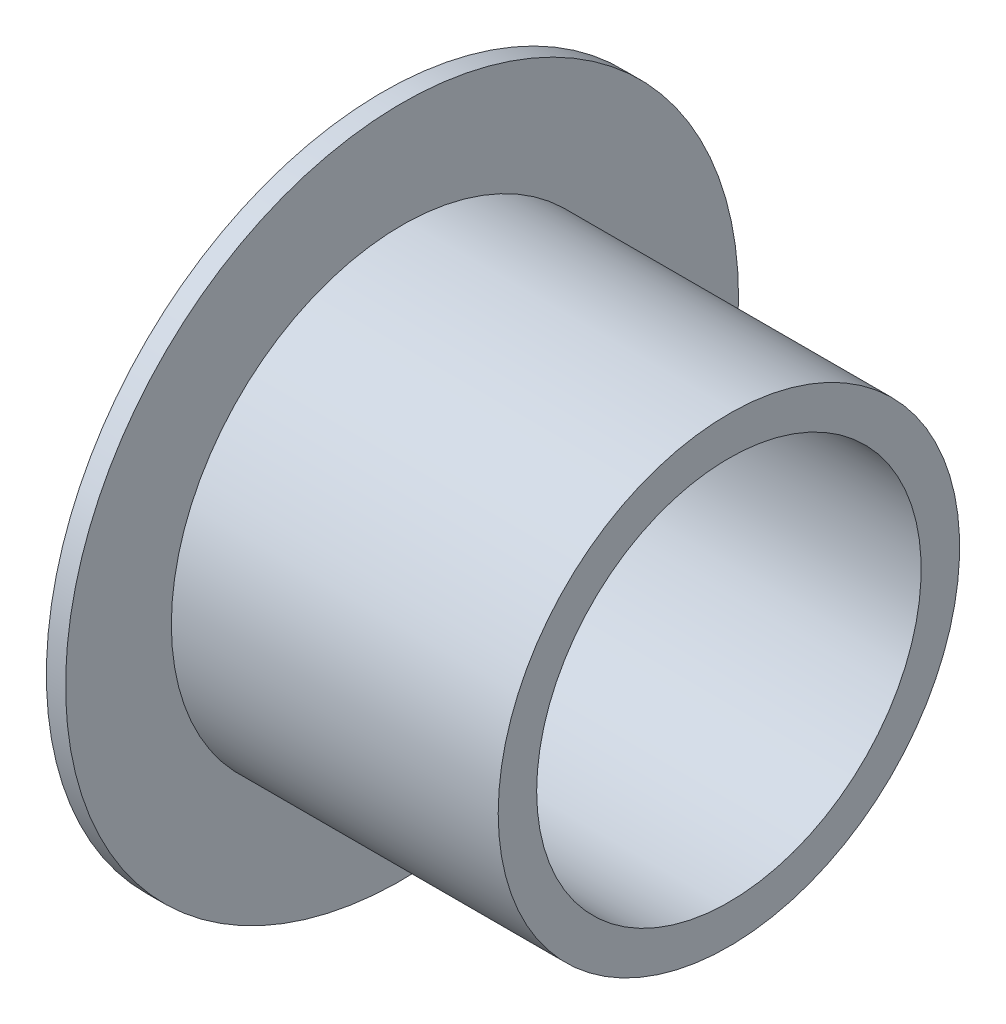
ISO-10303-21;
HEADER;
FILE_DESCRIPTION(('STEP AP214'),'2;1');
FILE_NAME('part.step','',(''),(''),'','','');
FILE_SCHEMA(('AUTOMOTIVE_DESIGN { 1 0 10303 214 1 1 1 1 }'));
ENDSEC;
DATA;
#1=APPLICATION_CONTEXT('core data for automotive mechanical design processes');
#2=APPLICATION_PROTOCOL_DEFINITION('international standard','automotive_design',2000,#1);
#3=PRODUCT_CONTEXT('',#1,'mechanical');
#4=PRODUCT('Part','Part','',(#3));
#5=PRODUCT_RELATED_PRODUCT_CATEGORY('part','',(#4));
#6=PRODUCT_DEFINITION_FORMATION('','',#4);
#7=PRODUCT_DEFINITION_CONTEXT('part definition',#1,'design');
#8=PRODUCT_DEFINITION('design','',#6,#7);
#9=PRODUCT_DEFINITION_SHAPE('','',#8);
#10=(LENGTH_UNIT() NAMED_UNIT(*) SI_UNIT(.MILLI.,.METRE.));
#11=(NAMED_UNIT(*) PLANE_ANGLE_UNIT() SI_UNIT($,.RADIAN.));
#12=(NAMED_UNIT(*) SI_UNIT($,.STERADIAN.) SOLID_ANGLE_UNIT());
#13=UNCERTAINTY_MEASURE_WITH_UNIT(LENGTH_MEASURE(1.E-05),#10,'distance_accuracy_value','');
#14=(GEOMETRIC_REPRESENTATION_CONTEXT(3) GLOBAL_UNCERTAINTY_ASSIGNED_CONTEXT((#13)) GLOBAL_UNIT_ASSIGNED_CONTEXT((#10,
#11,#12)) REPRESENTATION_CONTEXT('',''));
#15=CARTESIAN_POINT('',(0.,0.,0.));
#16=DIRECTION('',(0.,0.,1.));
#17=DIRECTION('',(1.,0.,0.));
#18=AXIS2_PLACEMENT_3D('',#15,#16,#17);
#19=CARTESIAN_POINT('',(3.4,0.,0.));
#20=DIRECTION('',(-1.,0.,0.));
#21=DIRECTION('',(0.,0.,1.));
#22=AXIS2_PLACEMENT_3D('',#19,#20,#21);
#23=CYLINDRICAL_SURFACE('',#22,2.4);
#24=CARTESIAN_POINT('',(0.,0.,0.));
#25=DIRECTION('',(-1.,0.,0.));
#26=DIRECTION('',(0.,0.,1.));
#27=AXIS2_PLACEMENT_3D('',#24,#25,#26);
#28=CIRCLE('',#27,2.4);
#29=CARTESIAN_POINT('',(0.,0.,2.4));
#30=VERTEX_POINT('',#29);
#31=EDGE_CURVE('E18',#30,#30,#28,.F.);
#32=ORIENTED_EDGE('',*,*,#31,.T.);
#33=EDGE_LOOP('',(#32));
#34=FACE_BOUND('',#33,.T.);
#35=CARTESIAN_POINT('',(3.4,0.,0.));
#36=DIRECTION('',(-1.,0.,0.));
#37=DIRECTION('',(0.,0.,1.));
#38=AXIS2_PLACEMENT_3D('',#35,#36,#37);
#39=CIRCLE('',#38,2.4);
#40=CARTESIAN_POINT('',(3.4,0.,2.4));
#41=VERTEX_POINT('',#40);
#42=EDGE_CURVE('E34',#41,#41,#39,.F.);
#43=ORIENTED_EDGE('',*,*,#42,.F.);
#44=EDGE_LOOP('',(#43));
#45=FACE_BOUND('',#44,.T.);
#46=ADVANCED_FACE('F15',(#34,#45),#23,.T.);
#47=CARTESIAN_POINT('',(0.,0.,0.));
#48=DIRECTION('',(-1.,0.,0.));
#49=DIRECTION('',(0.,0.,1.));
#50=AXIS2_PLACEMENT_3D('',#47,#48,#49);
#51=PLANE('',#50);
#52=ORIENTED_EDGE('',*,*,#31,.F.);
#53=EDGE_LOOP('',(#52));
#54=FACE_BOUND('',#53,.T.);
#55=CARTESIAN_POINT('',(0.,0.,0.));
#56=DIRECTION('',(1.,0.,0.));
#57=DIRECTION('',(0.,0.,-1.));
#58=AXIS2_PLACEMENT_3D('',#55,#56,#57);
#59=CIRCLE('',#58,3.5);
#60=CARTESIAN_POINT('',(0.,0.,-3.5));
#61=VERTEX_POINT('',#60);
#62=EDGE_CURVE('E32',#61,#61,#59,.F.);
#63=ORIENTED_EDGE('',*,*,#62,.F.);
#64=EDGE_LOOP('',(#63));
#65=FACE_BOUND('',#64,.T.);
#66=ADVANCED_FACE('F43',(#54,#65),#51,.F.);
#67=CARTESIAN_POINT('',(3.4,0.,0.));
#68=DIRECTION('',(1.,0.,0.));
#69=DIRECTION('',(0.,0.,-1.));
#70=AXIS2_PLACEMENT_3D('',#67,#68,#69);
#71=PLANE('',#70);
#72=CARTESIAN_POINT('',(3.4,0.,0.));
#73=DIRECTION('',(-1.,0.,0.));
#74=DIRECTION('',(0.,0.,1.));
#75=AXIS2_PLACEMENT_3D('',#72,#73,#74);
#76=CIRCLE('',#75,2.);
#77=CARTESIAN_POINT('',(3.4,0.,2.));
#78=VERTEX_POINT('',#77);
#79=EDGE_CURVE('E27',#78,#78,#76,.T.);
#80=ORIENTED_EDGE('',*,*,#79,.T.);
#81=EDGE_LOOP('',(#80));
#82=FACE_BOUND('',#81,.T.);
#83=ORIENTED_EDGE('',*,*,#42,.T.);
#84=EDGE_LOOP('',(#83));
#85=FACE_BOUND('',#84,.T.);
#86=ADVANCED_FACE('F46',(#82,#85),#71,.T.);
#87=CARTESIAN_POINT('',(-0.2,0.,0.));
#88=DIRECTION('',(1.,0.,0.));
#89=DIRECTION('',(0.,0.,-1.));
#90=AXIS2_PLACEMENT_3D('',#87,#88,#89);
#91=CYLINDRICAL_SURFACE('',#90,3.5);
#92=ORIENTED_EDGE('',*,*,#62,.T.);
#93=EDGE_LOOP('',(#92));
#94=FACE_BOUND('',#93,.T.);
#95=CARTESIAN_POINT('',(-0.2,0.,0.));
#96=DIRECTION('',(1.,0.,0.));
#97=DIRECTION('',(0.,0.,-1.));
#98=AXIS2_PLACEMENT_3D('',#95,#96,#97);
#99=CIRCLE('',#98,3.5);
#100=CARTESIAN_POINT('',(-0.2,0.,-3.5));
#101=VERTEX_POINT('',#100);
#102=EDGE_CURVE('E22',#101,#101,#99,.F.);
#103=ORIENTED_EDGE('',*,*,#102,.F.);
#104=EDGE_LOOP('',(#103));
#105=FACE_BOUND('',#104,.T.);
#106=ADVANCED_FACE('F49',(#94,#105),#91,.T.);
#107=CARTESIAN_POINT('',(3.4,0.,0.));
#108=DIRECTION('',(-1.,0.,0.));
#109=DIRECTION('',(0.,0.,1.));
#110=AXIS2_PLACEMENT_3D('',#107,#108,#109);
#111=CYLINDRICAL_SURFACE('',#110,2.);
#112=CARTESIAN_POINT('',(-0.2,0.,0.));
#113=DIRECTION('',(-1.,0.,0.));
#114=DIRECTION('',(0.,0.,1.));
#115=AXIS2_PLACEMENT_3D('',#112,#113,#114);
#116=CIRCLE('',#115,2.);
#117=CARTESIAN_POINT('',(-0.2,0.,2.));
#118=VERTEX_POINT('',#117);
#119=EDGE_CURVE('E9',#118,#118,#116,.F.);
#120=ORIENTED_EDGE('',*,*,#119,.F.);
#121=EDGE_LOOP('',(#120));
#122=FACE_BOUND('',#121,.T.);
#123=ORIENTED_EDGE('',*,*,#79,.F.);
#124=EDGE_LOOP('',(#123));
#125=FACE_BOUND('',#124,.T.);
#126=ADVANCED_FACE('F52',(#122,#125),#111,.F.);
#127=CARTESIAN_POINT('',(-0.2,0.,0.));
#128=DIRECTION('',(-1.,0.,0.));
#129=DIRECTION('',(0.,0.,1.));
#130=AXIS2_PLACEMENT_3D('',#127,#128,#129);
#131=PLANE('',#130);
#132=ORIENTED_EDGE('',*,*,#119,.T.);
#133=EDGE_LOOP('',(#132));
#134=FACE_BOUND('',#133,.T.);
#135=ORIENTED_EDGE('',*,*,#102,.T.);
#136=EDGE_LOOP('',(#135));
#137=FACE_BOUND('',#136,.T.);
#138=ADVANCED_FACE('F56',(#134,#137),#131,.T.);
#139=CLOSED_SHELL('',(#46,#66,#86,#106,#126,#138));
#140=MANIFOLD_SOLID_BREP('B1',#139);
#141=ADVANCED_BREP_SHAPE_REPRESENTATION('',(#18,#140),#14);
#142=SHAPE_DEFINITION_REPRESENTATION(#9,#141);
ENDSEC;
END-ISO-10303-21;
